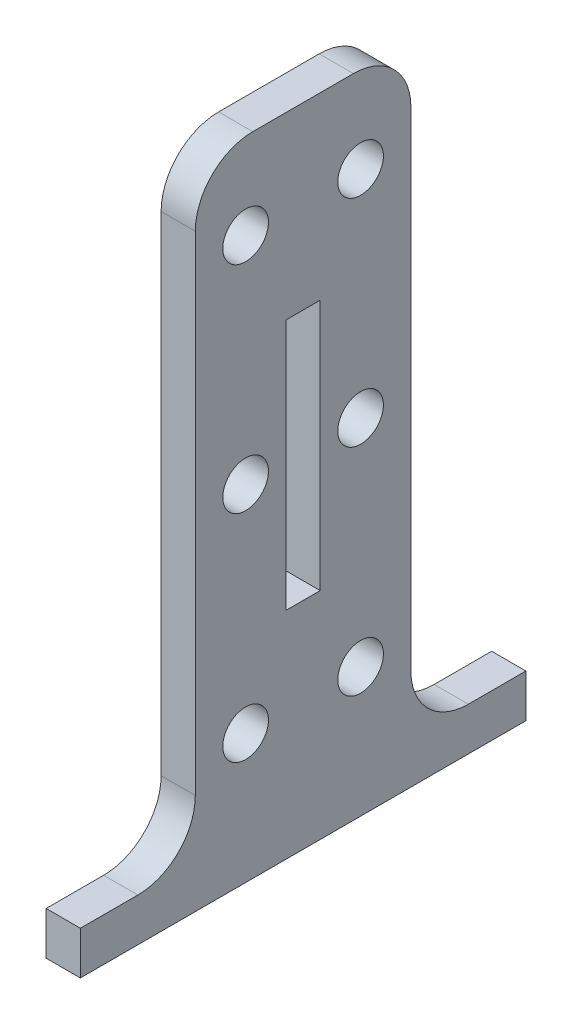
ISO-10303-21;
HEADER;
FILE_DESCRIPTION(('STEP AP214'),'2;1');
FILE_NAME('part.step','',(''),(''),'','','');
FILE_SCHEMA(('AUTOMOTIVE_DESIGN { 1 0 10303 214 1 1 1 1 }'));
ENDSEC;
DATA;
#1=APPLICATION_CONTEXT('core data for automotive mechanical design processes');
#2=APPLICATION_PROTOCOL_DEFINITION('international standard','automotive_design',2000,#1);
#3=PRODUCT_CONTEXT('',#1,'mechanical');
#4=PRODUCT('Part','Part','',(#3));
#5=PRODUCT_RELATED_PRODUCT_CATEGORY('part','',(#4));
#6=PRODUCT_DEFINITION_FORMATION('','',#4);
#7=PRODUCT_DEFINITION_CONTEXT('part definition',#1,'design');
#8=PRODUCT_DEFINITION('design','',#6,#7);
#9=PRODUCT_DEFINITION_SHAPE('','',#8);
#10=(LENGTH_UNIT() NAMED_UNIT(*) SI_UNIT(.MILLI.,.METRE.));
#11=(NAMED_UNIT(*) PLANE_ANGLE_UNIT() SI_UNIT($,.RADIAN.));
#12=(NAMED_UNIT(*) SI_UNIT($,.STERADIAN.) SOLID_ANGLE_UNIT());
#13=UNCERTAINTY_MEASURE_WITH_UNIT(LENGTH_MEASURE(1.E-05),#10,'distance_accuracy_value','');
#14=(GEOMETRIC_REPRESENTATION_CONTEXT(3) GLOBAL_UNCERTAINTY_ASSIGNED_CONTEXT((#13)) GLOBAL_UNIT_ASSIGNED_CONTEXT((#10,
#11,#12)) REPRESENTATION_CONTEXT('',''));
#15=CARTESIAN_POINT('',(0.,0.,0.));
#16=DIRECTION('',(0.,0.,1.));
#17=DIRECTION('',(1.,0.,0.));
#18=AXIS2_PLACEMENT_3D('',#15,#16,#17);
#19=CARTESIAN_POINT('',(4.76,-65.,12.62));
#20=DIRECTION('',(0.,0.,-1.));
#21=DIRECTION('',(0.,1.,0.));
#22=AXIS2_PLACEMENT_3D('',#19,#20,#21);
#23=PLANE('',#22);
#24=DIRECTION('',(-1.,0.,0.));
#25=VECTOR('',#24,1.);
#26=CARTESIAN_POINT('',(4.76,30.,12.62));
#27=LINE('',#26,#25);
#28=CARTESIAN_POINT('',(4.76,30.,12.62));
#29=VERTEX_POINT('',#28);
#30=CARTESIAN_POINT('',(0.,30.,12.62));
#31=VERTEX_POINT('',#30);
#32=EDGE_CURVE('E64',#29,#31,#27,.T.);
#33=ORIENTED_EDGE('',*,*,#32,.F.);
#34=DIRECTION('',(0.,-1.,0.));
#35=VECTOR('',#34,1.);
#36=CARTESIAN_POINT('',(4.76,-65.,12.62));
#37=LINE('',#36,#35);
#38=CARTESIAN_POINT('',(4.76,65.,12.62));
#39=VERTEX_POINT('',#38);
#40=EDGE_CURVE('E186',#39,#29,#37,.T.);
#41=ORIENTED_EDGE('',*,*,#40,.F.);
#42=DIRECTION('',(-1.,0.,0.));
#43=VECTOR('',#42,1.);
#44=CARTESIAN_POINT('',(4.76,65.,12.62));
#45=LINE('',#44,#43);
#46=CARTESIAN_POINT('',(0.,65.,12.62));
#47=VERTEX_POINT('',#46);
#48=EDGE_CURVE('E198',#39,#47,#45,.T.);
#49=ORIENTED_EDGE('',*,*,#48,.T.);
#50=DIRECTION('',(0.,-1.,0.));
#51=VECTOR('',#50,1.);
#52=CARTESIAN_POINT('',(0.,-65.,12.62));
#53=LINE('',#52,#51);
#54=EDGE_CURVE('E59',#47,#31,#53,.T.);
#55=ORIENTED_EDGE('',*,*,#54,.T.);
#56=EDGE_LOOP('',(#33,#41,#49,#55));
#57=FACE_BOUND('',#56,.T.);
#58=ADVANCED_FACE('F43',(#57),#23,.F.);
#59=CARTESIAN_POINT('',(4.76,-65.,17.38));
#60=DIRECTION('',(0.,0.,1.));
#61=DIRECTION('',(1.,0.,0.));
#62=AXIS2_PLACEMENT_3D('',#59,#60,#61);
#63=PLANE('',#62);
#64=DIRECTION('',(-1.,0.,0.));
#65=VECTOR('',#64,1.);
#66=CARTESIAN_POINT('',(4.76,30.,17.38));
#67=LINE('',#66,#65);
#68=CARTESIAN_POINT('',(4.76,30.,17.38));
#69=VERTEX_POINT('',#68);
#70=CARTESIAN_POINT('',(0.,30.,17.38));
#71=VERTEX_POINT('',#70);
#72=EDGE_CURVE('E169',#69,#71,#67,.T.);
#73=ORIENTED_EDGE('',*,*,#72,.T.);
#74=DIRECTION('',(0.,1.,0.));
#75=VECTOR('',#74,1.);
#76=CARTESIAN_POINT('',(0.,-65.,17.38));
#77=LINE('',#76,#75);
#78=CARTESIAN_POINT('',(0.,65.,17.38));
#79=VERTEX_POINT('',#78);
#80=EDGE_CURVE('E155',#71,#79,#77,.T.);
#81=ORIENTED_EDGE('',*,*,#80,.T.);
#82=DIRECTION('',(-1.,0.,0.));
#83=VECTOR('',#82,1.);
#84=CARTESIAN_POINT('',(4.76,65.,17.38));
#85=LINE('',#84,#83);
#86=CARTESIAN_POINT('',(4.76,65.,17.38));
#87=VERTEX_POINT('',#86);
#88=EDGE_CURVE('E193',#87,#79,#85,.T.);
#89=ORIENTED_EDGE('',*,*,#88,.F.);
#90=DIRECTION('',(0.,-1.,0.));
#91=VECTOR('',#90,1.);
#92=CARTESIAN_POINT('',(4.76,0.,17.38));
#93=LINE('',#92,#91);
#94=EDGE_CURVE('E11',#87,#69,#93,.T.);
#95=ORIENTED_EDGE('',*,*,#94,.T.);
#96=EDGE_LOOP('',(#73,#81,#89,#95));
#97=FACE_BOUND('',#96,.T.);
#98=ADVANCED_FACE('F170',(#97),#63,.F.);
#99=CARTESIAN_POINT('',(0.,0.,30.));
#100=DIRECTION('',(0.,0.,-1.));
#101=DIRECTION('',(-1.,0.,0.));
#102=AXIS2_PLACEMENT_3D('',#99,#100,#101);
#103=PLANE('',#102);
#104=DIRECTION('',(0.,-1.,0.));
#105=VECTOR('',#104,1.);
#106=CARTESIAN_POINT('',(4.76,0.,30.));
#107=LINE('',#106,#105);
#108=CARTESIAN_POINT('',(4.76,82.,30.));
#109=VERTEX_POINT('',#108);
#110=CARTESIAN_POINT('',(4.76,14.,30.));
#111=VERTEX_POINT('',#110);
#112=EDGE_CURVE('E254',#109,#111,#107,.T.);
#113=ORIENTED_EDGE('',*,*,#112,.F.);
#114=DIRECTION('',(1.,0.,0.));
#115=VECTOR('',#114,1.);
#116=CARTESIAN_POINT('',(0.,82.,30.));
#117=LINE('',#116,#115);
#118=CARTESIAN_POINT('',(0.,82.,30.));
#119=VERTEX_POINT('',#118);
#120=EDGE_CURVE('E359',#109,#119,#117,.F.);
#121=ORIENTED_EDGE('',*,*,#120,.T.);
#122=DIRECTION('',(0.,-1.,0.));
#123=VECTOR('',#122,1.);
#124=CARTESIAN_POINT('',(0.,0.,30.));
#125=LINE('',#124,#123);
#126=CARTESIAN_POINT('',(0.,14.,30.));
#127=VERTEX_POINT('',#126);
#128=EDGE_CURVE('E322',#119,#127,#125,.T.);
#129=ORIENTED_EDGE('',*,*,#128,.T.);
#130=DIRECTION('',(-1.,0.,0.));
#131=VECTOR('',#130,1.);
#132=CARTESIAN_POINT('',(6.,14.,30.));
#133=LINE('',#132,#131);
#134=EDGE_CURVE('E334',#127,#111,#133,.F.);
#135=ORIENTED_EDGE('',*,*,#134,.T.);
#136=EDGE_LOOP('',(#113,#121,#129,#135));
#137=FACE_BOUND('',#136,.T.);
#138=ADVANCED_FACE('F397',(#137),#103,.F.);
#139=CARTESIAN_POINT('',(60.,0.,30.));
#140=DIRECTION('',(0.,1.,0.));
#141=DIRECTION('',(-1.,0.,0.));
#142=AXIS2_PLACEMENT_3D('',#139,#140,#141);
#143=PLANE('',#142);
#144=DIRECTION('',(0.,0.,-1.));
#145=VECTOR('',#144,1.);
#146=CARTESIAN_POINT('',(0.,0.,30.));
#147=LINE('',#146,#145);
#148=CARTESIAN_POINT('',(0.,0.,46.));
#149=VERTEX_POINT('',#148);
#150=CARTESIAN_POINT('',(0.,0.,-16.));
#151=VERTEX_POINT('',#150);
#152=EDGE_CURVE('E325',#149,#151,#147,.T.);
#153=ORIENTED_EDGE('',*,*,#152,.T.);
#154=DIRECTION('',(-1.,0.,0.));
#155=VECTOR('',#154,1.);
#156=CARTESIAN_POINT('',(56.4,0.,-16.));
#157=LINE('',#156,#155);
#158=CARTESIAN_POINT('',(4.76,0.,-16.));
#159=VERTEX_POINT('',#158);
#160=EDGE_CURVE('E287',#159,#151,#157,.T.);
#161=ORIENTED_EDGE('',*,*,#160,.F.);
#162=DIRECTION('',(0.,0.,-1.));
#163=VECTOR('',#162,1.);
#164=CARTESIAN_POINT('',(4.76,0.,-16.));
#165=LINE('',#164,#163);
#166=CARTESIAN_POINT('',(4.76,0.,46.));
#167=VERTEX_POINT('',#166);
#168=EDGE_CURVE('E212',#167,#159,#165,.T.);
#169=ORIENTED_EDGE('',*,*,#168,.F.);
#170=DIRECTION('',(1.,0.,0.));
#171=VECTOR('',#170,1.);
#172=CARTESIAN_POINT('',(56.4,0.,46.));
#173=LINE('',#172,#171);
#174=EDGE_CURVE('E309',#149,#167,#173,.T.);
#175=ORIENTED_EDGE('',*,*,#174,.F.);
#176=EDGE_LOOP('',(#153,#161,#169,#175));
#177=FACE_BOUND('',#176,.T.);
#178=ADVANCED_FACE('F462',(#177),#143,.F.);
#179=CARTESIAN_POINT('',(0.,0.,0.));
#180=DIRECTION('',(0.,0.,-1.));
#181=DIRECTION('',(-1.,0.,0.));
#182=AXIS2_PLACEMENT_3D('',#179,#180,#181);
#183=PLANE('',#182);
#184=DIRECTION('',(1.,0.,0.));
#185=VECTOR('',#184,1.);
#186=CARTESIAN_POINT('',(6.,82.,0.));
#187=LINE('',#186,#185);
#188=CARTESIAN_POINT('',(0.,82.,0.));
#189=VERTEX_POINT('',#188);
#190=CARTESIAN_POINT('',(4.76,82.,0.));
#191=VERTEX_POINT('',#190);
#192=EDGE_CURVE('E52',#189,#191,#187,.T.);
#193=ORIENTED_EDGE('',*,*,#192,.T.);
#194=DIRECTION('',(0.,-1.,0.));
#195=VECTOR('',#194,1.);
#196=CARTESIAN_POINT('',(4.76,0.,0.));
#197=LINE('',#196,#195);
#198=CARTESIAN_POINT('',(4.76,14.,0.));
#199=VERTEX_POINT('',#198);
#200=EDGE_CURVE('E240',#191,#199,#197,.T.);
#201=ORIENTED_EDGE('',*,*,#200,.T.);
#202=DIRECTION('',(1.,0.,0.));
#203=VECTOR('',#202,1.);
#204=CARTESIAN_POINT('',(0.,14.,0.));
#205=LINE('',#204,#203);
#206=CARTESIAN_POINT('',(0.,14.,0.));
#207=VERTEX_POINT('',#206);
#208=EDGE_CURVE('E342',#199,#207,#205,.F.);
#209=ORIENTED_EDGE('',*,*,#208,.T.);
#210=DIRECTION('',(0.,-1.,0.));
#211=VECTOR('',#210,1.);
#212=CARTESIAN_POINT('',(0.,0.,0.));
#213=LINE('',#212,#211);
#214=EDGE_CURVE('E321',#189,#207,#213,.T.);
#215=ORIENTED_EDGE('',*,*,#214,.F.);
#216=EDGE_LOOP('',(#193,#201,#209,#215));
#217=FACE_BOUND('',#216,.T.);
#218=ADVANCED_FACE('F458',(#217),#183,.T.);
#219=CARTESIAN_POINT('',(60.,6.,12.));
#220=DIRECTION('',(0.,-1.,0.));
#221=DIRECTION('',(0.,0.,-1.));
#222=AXIS2_PLACEMENT_3D('',#219,#220,#221);
#223=PLANE('',#222);
#224=DIRECTION('',(0.,0.,1.));
#225=VECTOR('',#224,1.);
#226=CARTESIAN_POINT('',(4.76,6.,12.));
#227=LINE('',#226,#225);
#228=CARTESIAN_POINT('',(4.76,5.99999999999999,-16.));
#229=VERTEX_POINT('',#228);
#230=CARTESIAN_POINT('',(4.76,6.,-8.));
#231=VERTEX_POINT('',#230);
#232=EDGE_CURVE('E247',#229,#231,#227,.T.);
#233=ORIENTED_EDGE('',*,*,#232,.F.);
#234=DIRECTION('',(1.,0.,0.));
#235=VECTOR('',#234,1.);
#236=CARTESIAN_POINT('',(56.4,6.,-16.));
#237=LINE('',#236,#235);
#238=CARTESIAN_POINT('',(0.,6.,-16.));
#239=VERTEX_POINT('',#238);
#240=EDGE_CURVE('E294',#239,#229,#237,.T.);
#241=ORIENTED_EDGE('',*,*,#240,.F.);
#242=DIRECTION('',(0.,0.,1.));
#243=VECTOR('',#242,1.);
#244=CARTESIAN_POINT('',(0.,6.,-16.));
#245=LINE('',#244,#243);
#246=CARTESIAN_POINT('',(0.,6.,-8.));
#247=VERTEX_POINT('',#246);
#248=EDGE_CURVE('E298',#239,#247,#245,.T.);
#249=ORIENTED_EDGE('',*,*,#248,.T.);
#250=DIRECTION('',(1.,0.,0.));
#251=VECTOR('',#250,1.);
#252=CARTESIAN_POINT('',(60.,6.,-8.));
#253=LINE('',#252,#251);
#254=EDGE_CURVE('E338',#247,#231,#253,.T.);
#255=ORIENTED_EDGE('',*,*,#254,.T.);
#256=EDGE_LOOP('',(#233,#241,#249,#255));
#257=FACE_BOUND('',#256,.T.);
#258=ADVANCED_FACE('F454',(#257),#223,.F.);
#259=CARTESIAN_POINT('',(60.,6.,18.));
#260=DIRECTION('',(0.,-1.,0.));
#261=DIRECTION('',(0.,0.,-1.));
#262=AXIS2_PLACEMENT_3D('',#259,#260,#261);
#263=PLANE('',#262);
#264=DIRECTION('',(0.,0.,1.));
#265=VECTOR('',#264,1.);
#266=CARTESIAN_POINT('',(4.76,6.,18.));
#267=LINE('',#266,#265);
#268=CARTESIAN_POINT('',(4.76,6.,38.));
#269=VERTEX_POINT('',#268);
#270=CARTESIAN_POINT('',(4.76,6.,46.));
#271=VERTEX_POINT('',#270);
#272=EDGE_CURVE('E260',#269,#271,#267,.T.);
#273=ORIENTED_EDGE('',*,*,#272,.F.);
#274=DIRECTION('',(-1.,0.,0.));
#275=VECTOR('',#274,1.);
#276=CARTESIAN_POINT('',(0.,6.,38.));
#277=LINE('',#276,#275);
#278=CARTESIAN_POINT('',(0.,6.,38.));
#279=VERTEX_POINT('',#278);
#280=EDGE_CURVE('E331',#269,#279,#277,.T.);
#281=ORIENTED_EDGE('',*,*,#280,.T.);
#282=DIRECTION('',(0.,0.,-1.));
#283=VECTOR('',#282,1.);
#284=CARTESIAN_POINT('',(0.,6.,46.));
#285=LINE('',#284,#283);
#286=CARTESIAN_POINT('',(0.,6.,46.));
#287=VERTEX_POINT('',#286);
#288=EDGE_CURVE('E313',#287,#279,#285,.T.);
#289=ORIENTED_EDGE('',*,*,#288,.F.);
#290=DIRECTION('',(-1.,0.,0.));
#291=VECTOR('',#290,1.);
#292=CARTESIAN_POINT('',(56.4,6.,46.));
#293=LINE('',#292,#291);
#294=EDGE_CURVE('E302',#271,#287,#293,.T.);
#295=ORIENTED_EDGE('',*,*,#294,.F.);
#296=EDGE_LOOP('',(#273,#281,#289,#295));
#297=FACE_BOUND('',#296,.T.);
#298=ADVANCED_FACE('F450',(#297),#263,.F.);
#299=CARTESIAN_POINT('',(0.,90.,30.));
#300=DIRECTION('',(0.,-1.,0.));
#301=DIRECTION('',(0.,0.,-1.));
#302=AXIS2_PLACEMENT_3D('',#299,#300,#301);
#303=PLANE('',#302);
#304=DIRECTION('',(0.,0.,1.));
#305=VECTOR('',#304,1.);
#306=CARTESIAN_POINT('',(4.76,90.,-16.));
#307=LINE('',#306,#305);
#308=CARTESIAN_POINT('',(4.76,90.,8.));
#309=VERTEX_POINT('',#308);
#310=CARTESIAN_POINT('',(4.76,90.,22.));
#311=VERTEX_POINT('',#310);
#312=EDGE_CURVE('E206',#309,#311,#307,.T.);
#313=ORIENTED_EDGE('',*,*,#312,.F.);
#314=DIRECTION('',(1.,0.,0.));
#315=VECTOR('',#314,1.);
#316=CARTESIAN_POINT('',(0.,90.,8.));
#317=LINE('',#316,#315);
#318=CARTESIAN_POINT('',(0.,90.,8.));
#319=VERTEX_POINT('',#318);
#320=EDGE_CURVE('E352',#309,#319,#317,.F.);
#321=ORIENTED_EDGE('',*,*,#320,.T.);
#322=DIRECTION('',(0.,0.,-1.));
#323=VECTOR('',#322,1.);
#324=CARTESIAN_POINT('',(0.,90.,30.));
#325=LINE('',#324,#323);
#326=CARTESIAN_POINT('',(0.,90.,22.));
#327=VERTEX_POINT('',#326);
#328=EDGE_CURVE('E317',#327,#319,#325,.T.);
#329=ORIENTED_EDGE('',*,*,#328,.F.);
#330=DIRECTION('',(1.,0.,0.));
#331=VECTOR('',#330,1.);
#332=CARTESIAN_POINT('',(0.,90.,22.));
#333=LINE('',#332,#331);
#334=EDGE_CURVE('E355',#327,#311,#333,.T.);
#335=ORIENTED_EDGE('',*,*,#334,.T.);
#336=EDGE_LOOP('',(#313,#321,#329,#335));
#337=FACE_BOUND('',#336,.T.);
#338=ADVANCED_FACE('F446',(#337),#303,.F.);
#339=CARTESIAN_POINT('',(0.,0.,46.));
#340=DIRECTION('',(0.,0.,-1.));
#341=DIRECTION('',(-1.,0.,0.));
#342=AXIS2_PLACEMENT_3D('',#339,#340,#341);
#343=PLANE('',#342);
#344=DIRECTION('',(0.,-1.,0.));
#345=VECTOR('',#344,1.);
#346=CARTESIAN_POINT('',(4.76,0.,46.));
#347=LINE('',#346,#345);
#348=EDGE_CURVE('E209',#271,#167,#347,.T.);
#349=ORIENTED_EDGE('',*,*,#348,.F.);
#350=ORIENTED_EDGE('',*,*,#294,.T.);
#351=DIRECTION('',(0.,-1.,0.));
#352=VECTOR('',#351,1.);
#353=CARTESIAN_POINT('',(0.,6.,46.));
#354=LINE('',#353,#352);
#355=EDGE_CURVE('E305',#287,#149,#354,.T.);
#356=ORIENTED_EDGE('',*,*,#355,.T.);
#357=ORIENTED_EDGE('',*,*,#174,.T.);
#358=EDGE_LOOP('',(#349,#350,#356,#357));
#359=FACE_BOUND('',#358,.T.);
#360=ADVANCED_FACE('F442',(#359),#343,.F.);
#361=CARTESIAN_POINT('',(0.,0.,-16.));
#362=DIRECTION('',(0.,0.,-1.));
#363=DIRECTION('',(-1.,0.,0.));
#364=AXIS2_PLACEMENT_3D('',#361,#362,#363);
#365=PLANE('',#364);
#366=ORIENTED_EDGE('',*,*,#240,.T.);
#367=DIRECTION('',(0.,1.,0.));
#368=VECTOR('',#367,1.);
#369=CARTESIAN_POINT('',(4.76,0.,-16.));
#370=LINE('',#369,#368);
#371=EDGE_CURVE('E201',#159,#229,#370,.T.);
#372=ORIENTED_EDGE('',*,*,#371,.F.);
#373=ORIENTED_EDGE('',*,*,#160,.T.);
#374=DIRECTION('',(0.,1.,0.));
#375=VECTOR('',#374,1.);
#376=CARTESIAN_POINT('',(0.,6.,-16.));
#377=LINE('',#376,#375);
#378=EDGE_CURVE('E291',#151,#239,#377,.T.);
#379=ORIENTED_EDGE('',*,*,#378,.T.);
#380=EDGE_LOOP('',(#366,#372,#373,#379));
#381=FACE_BOUND('',#380,.T.);
#382=ADVANCED_FACE('F438',(#381),#365,.T.);
#383=CARTESIAN_POINT('',(60.,14.,38.));
#384=DIRECTION('',(1.,0.,0.));
#385=DIRECTION('',(0.,0.,-1.));
#386=AXIS2_PLACEMENT_3D('',#383,#384,#385);
#387=CYLINDRICAL_SURFACE('',#386,8.);
#388=CARTESIAN_POINT('',(4.76,14.,38.));
#389=DIRECTION('',(1.,0.,0.));
#390=DIRECTION('',(0.,0.,-1.));
#391=AXIS2_PLACEMENT_3D('',#388,#389,#390);
#392=CIRCLE('',#391,8.);
#393=EDGE_CURVE('E257',#111,#269,#392,.F.);
#394=ORIENTED_EDGE('',*,*,#393,.F.);
#395=ORIENTED_EDGE('',*,*,#134,.F.);
#396=CARTESIAN_POINT('',(0.,14.,38.));
#397=DIRECTION('',(1.,0.,0.));
#398=DIRECTION('',(0.,0.,-1.));
#399=AXIS2_PLACEMENT_3D('',#396,#397,#398);
#400=CIRCLE('',#399,8.);
#401=EDGE_CURVE('E345',#279,#127,#400,.T.);
#402=ORIENTED_EDGE('',*,*,#401,.F.);
#403=ORIENTED_EDGE('',*,*,#280,.F.);
#404=EDGE_LOOP('',(#394,#395,#402,#403));
#405=FACE_BOUND('',#404,.T.);
#406=ADVANCED_FACE('F441',(#405),#387,.F.);
#407=CARTESIAN_POINT('',(60.,14.,-8.));
#408=DIRECTION('',(1.,0.,0.));
#409=DIRECTION('',(0.,0.,-1.));
#410=AXIS2_PLACEMENT_3D('',#407,#408,#409);
#411=CYLINDRICAL_SURFACE('',#410,8.);
#412=CARTESIAN_POINT('',(4.76,14.,-8.));
#413=DIRECTION('',(1.,0.,0.));
#414=DIRECTION('',(0.,0.,-1.));
#415=AXIS2_PLACEMENT_3D('',#412,#413,#414);
#416=CIRCLE('',#415,8.);
#417=EDGE_CURVE('E244',#231,#199,#416,.F.);
#418=ORIENTED_EDGE('',*,*,#417,.F.);
#419=ORIENTED_EDGE('',*,*,#254,.F.);
#420=CARTESIAN_POINT('',(0.,14.,-8.));
#421=DIRECTION('',(1.,0.,0.));
#422=DIRECTION('',(0.,0.,-1.));
#423=AXIS2_PLACEMENT_3D('',#420,#421,#422);
#424=CIRCLE('',#423,8.);
#425=EDGE_CURVE('E349',#207,#247,#424,.T.);
#426=ORIENTED_EDGE('',*,*,#425,.F.);
#427=ORIENTED_EDGE('',*,*,#208,.F.);
#428=EDGE_LOOP('',(#418,#419,#426,#427));
#429=FACE_BOUND('',#428,.T.);
#430=ADVANCED_FACE('F472',(#429),#411,.F.);
#431=CARTESIAN_POINT('',(0.,82.,22.));
#432=DIRECTION('',(1.,0.,0.));
#433=DIRECTION('',(0.,0.,-1.));
#434=AXIS2_PLACEMENT_3D('',#431,#432,#433);
#435=CYLINDRICAL_SURFACE('',#434,8.);
#436=ORIENTED_EDGE('',*,*,#120,.F.);
#437=CARTESIAN_POINT('',(4.76,82.,22.));
#438=DIRECTION('',(1.,0.,0.));
#439=DIRECTION('',(0.,0.,-1.));
#440=AXIS2_PLACEMENT_3D('',#437,#438,#439);
#441=CIRCLE('',#440,8.);
#442=EDGE_CURVE('E250',#109,#311,#441,.F.);
#443=ORIENTED_EDGE('',*,*,#442,.T.);
#444=ORIENTED_EDGE('',*,*,#334,.F.);
#445=CARTESIAN_POINT('',(0.,82.,22.));
#446=DIRECTION('',(1.,0.,0.));
#447=DIRECTION('',(0.,0.,-1.));
#448=AXIS2_PLACEMENT_3D('',#445,#446,#447);
#449=CIRCLE('',#448,8.);
#450=EDGE_CURVE('E365',#119,#327,#449,.F.);
#451=ORIENTED_EDGE('',*,*,#450,.F.);
#452=EDGE_LOOP('',(#436,#443,#444,#451));
#453=FACE_BOUND('',#452,.T.);
#454=ADVANCED_FACE('F434',(#453),#435,.T.);
#455=CARTESIAN_POINT('',(0.,82.,8.));
#456=DIRECTION('',(-1.,0.,0.));
#457=DIRECTION('',(0.,0.,1.));
#458=AXIS2_PLACEMENT_3D('',#455,#456,#457);
#459=CYLINDRICAL_SURFACE('',#458,8.);
#460=ORIENTED_EDGE('',*,*,#320,.F.);
#461=CARTESIAN_POINT('',(4.76,82.,8.));
#462=DIRECTION('',(1.,0.,0.));
#463=DIRECTION('',(0.,0.,-1.));
#464=AXIS2_PLACEMENT_3D('',#461,#462,#463);
#465=CIRCLE('',#464,8.);
#466=EDGE_CURVE('E236',#309,#191,#465,.F.);
#467=ORIENTED_EDGE('',*,*,#466,.T.);
#468=ORIENTED_EDGE('',*,*,#192,.F.);
#469=CARTESIAN_POINT('',(0.,82.,8.));
#470=DIRECTION('',(1.,0.,0.));
#471=DIRECTION('',(0.,0.,-1.));
#472=AXIS2_PLACEMENT_3D('',#469,#470,#471);
#473=CIRCLE('',#472,8.);
#474=EDGE_CURVE('E362',#319,#189,#473,.F.);
#475=ORIENTED_EDGE('',*,*,#474,.F.);
#476=EDGE_LOOP('',(#460,#467,#468,#475));
#477=FACE_BOUND('',#476,.T.);
#478=ADVANCED_FACE('F45',(#477),#459,.T.);
#479=CARTESIAN_POINT('',(0.,78.,23.));
#480=DIRECTION('',(1.,0.,0.));
#481=DIRECTION('',(0.,0.,-1.));
#482=AXIS2_PLACEMENT_3D('',#479,#480,#481);
#483=CYLINDRICAL_SURFACE('',#482,3.175);
#484=CARTESIAN_POINT('',(0.,78.,23.));
#485=DIRECTION('',(1.,0.,0.));
#486=DIRECTION('',(0.,0.,-1.));
#487=AXIS2_PLACEMENT_3D('',#484,#485,#486);
#488=CIRCLE('',#487,3.175);
#489=CARTESIAN_POINT('',(0.,78.,19.825));
#490=VERTEX_POINT('',#489);
#491=EDGE_CURVE('E268',#490,#490,#488,.T.);
#492=ORIENTED_EDGE('',*,*,#491,.F.);
#493=EDGE_LOOP('',(#492));
#494=FACE_BOUND('',#493,.T.);
#495=CARTESIAN_POINT('',(4.76,78.,23.));
#496=DIRECTION('',(1.,0.,0.));
#497=DIRECTION('',(0.,0.,-1.));
#498=AXIS2_PLACEMENT_3D('',#495,#496,#497);
#499=CIRCLE('',#498,3.175);
#500=CARTESIAN_POINT('',(4.76,78.,19.825));
#501=VERTEX_POINT('',#500);
#502=EDGE_CURVE('E232',#501,#501,#499,.F.);
#503=ORIENTED_EDGE('',*,*,#502,.F.);
#504=EDGE_LOOP('',(#503));
#505=FACE_BOUND('',#504,.T.);
#506=ADVANCED_FACE('F409',(#494,#505),#483,.F.);
#507=CARTESIAN_POINT('',(0.,48.,23.));
#508=DIRECTION('',(1.,0.,0.));
#509=DIRECTION('',(0.,0.,-1.));
#510=AXIS2_PLACEMENT_3D('',#507,#508,#509);
#511=CYLINDRICAL_SURFACE('',#510,3.175);
#512=CARTESIAN_POINT('',(0.,48.,23.));
#513=DIRECTION('',(1.,0.,0.));
#514=DIRECTION('',(0.,0.,-1.));
#515=AXIS2_PLACEMENT_3D('',#512,#513,#514);
#516=CIRCLE('',#515,3.175);
#517=CARTESIAN_POINT('',(0.,48.,19.825));
#518=VERTEX_POINT('',#517);
#519=EDGE_CURVE('E264',#518,#518,#516,.T.);
#520=ORIENTED_EDGE('',*,*,#519,.F.);
#521=EDGE_LOOP('',(#520));
#522=FACE_BOUND('',#521,.T.);
#523=CARTESIAN_POINT('',(4.76,48.,23.));
#524=DIRECTION('',(1.,0.,0.));
#525=DIRECTION('',(0.,0.,-1.));
#526=AXIS2_PLACEMENT_3D('',#523,#524,#525);
#527=CIRCLE('',#526,3.175);
#528=CARTESIAN_POINT('',(4.76,48.,19.825));
#529=VERTEX_POINT('',#528);
#530=EDGE_CURVE('E228',#529,#529,#527,.F.);
#531=ORIENTED_EDGE('',*,*,#530,.F.);
#532=EDGE_LOOP('',(#531));
#533=FACE_BOUND('',#532,.T.);
#534=ADVANCED_FACE('F405',(#522,#533),#511,.F.);
#535=CARTESIAN_POINT('',(0.,18.,23.));
#536=DIRECTION('',(1.,0.,0.));
#537=DIRECTION('',(0.,0.,-1.));
#538=AXIS2_PLACEMENT_3D('',#535,#536,#537);
#539=CYLINDRICAL_SURFACE('',#538,3.175);
#540=CARTESIAN_POINT('',(0.,18.,23.));
#541=DIRECTION('',(1.,0.,0.));
#542=DIRECTION('',(0.,0.,-1.));
#543=AXIS2_PLACEMENT_3D('',#540,#541,#542);
#544=CIRCLE('',#543,3.175);
#545=CARTESIAN_POINT('',(0.,18.,19.825));
#546=VERTEX_POINT('',#545);
#547=EDGE_CURVE('E269',#546,#546,#544,.T.);
#548=ORIENTED_EDGE('',*,*,#547,.F.);
#549=EDGE_LOOP('',(#548));
#550=FACE_BOUND('',#549,.T.);
#551=CARTESIAN_POINT('',(4.76,18.,23.));
#552=DIRECTION('',(1.,0.,0.));
#553=DIRECTION('',(0.,0.,-1.));
#554=AXIS2_PLACEMENT_3D('',#551,#552,#553);
#555=CIRCLE('',#554,3.175);
#556=CARTESIAN_POINT('',(4.76,18.,19.825));
#557=VERTEX_POINT('',#556);
#558=EDGE_CURVE('E224',#557,#557,#555,.F.);
#559=ORIENTED_EDGE('',*,*,#558,.F.);
#560=EDGE_LOOP('',(#559));
#561=FACE_BOUND('',#560,.T.);
#562=ADVANCED_FACE('F408',(#550,#561),#539,.F.);
#563=CARTESIAN_POINT('',(0.,18.0000000000001,6.99999999999998));
#564=DIRECTION('',(1.,0.,0.));
#565=DIRECTION('',(0.,0.,-1.));
#566=AXIS2_PLACEMENT_3D('',#563,#564,#565);
#567=CYLINDRICAL_SURFACE('',#566,3.175);
#568=CARTESIAN_POINT('',(0.,18.0000000000001,6.99999999999998));
#569=DIRECTION('',(1.,0.,0.));
#570=DIRECTION('',(0.,0.,1.));
#571=AXIS2_PLACEMENT_3D('',#568,#569,#570);
#572=CIRCLE('',#571,3.175);
#573=CARTESIAN_POINT('',(0.,18.0000000000001,10.175));
#574=VERTEX_POINT('',#573);
#575=EDGE_CURVE('E273',#574,#574,#572,.T.);
#576=ORIENTED_EDGE('',*,*,#575,.F.);
#577=EDGE_LOOP('',(#576));
#578=FACE_BOUND('',#577,.T.);
#579=CARTESIAN_POINT('',(4.76,18.0000000000001,6.99999999999998));
#580=DIRECTION('',(1.,0.,0.));
#581=DIRECTION('',(0.,0.,-1.));
#582=AXIS2_PLACEMENT_3D('',#579,#580,#581);
#583=CIRCLE('',#582,3.175);
#584=CARTESIAN_POINT('',(4.76,18.0000000000001,3.82499999999998));
#585=VERTEX_POINT('',#584);
#586=EDGE_CURVE('E220',#585,#585,#583,.F.);
#587=ORIENTED_EDGE('',*,*,#586,.F.);
#588=EDGE_LOOP('',(#587));
#589=FACE_BOUND('',#588,.T.);
#590=ADVANCED_FACE('F387',(#578,#589),#567,.F.);
#591=CARTESIAN_POINT('',(0.,48.,6.99999999999998));
#592=DIRECTION('',(1.,0.,0.));
#593=DIRECTION('',(0.,0.,-1.));
#594=AXIS2_PLACEMENT_3D('',#591,#592,#593);
#595=CYLINDRICAL_SURFACE('',#594,3.175);
#596=CARTESIAN_POINT('',(0.,48.,6.99999999999998));
#597=DIRECTION('',(1.,0.,0.));
#598=DIRECTION('',(0.,0.,1.));
#599=AXIS2_PLACEMENT_3D('',#596,#597,#598);
#600=CIRCLE('',#599,3.175);
#601=CARTESIAN_POINT('',(0.,48.,10.175));
#602=VERTEX_POINT('',#601);
#603=EDGE_CURVE('E277',#602,#602,#600,.T.);
#604=ORIENTED_EDGE('',*,*,#603,.F.);
#605=EDGE_LOOP('',(#604));
#606=FACE_BOUND('',#605,.T.);
#607=CARTESIAN_POINT('',(4.76,48.,6.99999999999998));
#608=DIRECTION('',(1.,0.,0.));
#609=DIRECTION('',(0.,0.,-1.));
#610=AXIS2_PLACEMENT_3D('',#607,#608,#609);
#611=CIRCLE('',#610,3.175);
#612=CARTESIAN_POINT('',(4.76,48.,3.82499999999998));
#613=VERTEX_POINT('',#612);
#614=EDGE_CURVE('E216',#613,#613,#611,.F.);
#615=ORIENTED_EDGE('',*,*,#614,.F.);
#616=EDGE_LOOP('',(#615));
#617=FACE_BOUND('',#616,.T.);
#618=ADVANCED_FACE('F379',(#606,#617),#595,.F.);
#619=CARTESIAN_POINT('',(0.,78.,6.99999999999998));
#620=DIRECTION('',(1.,0.,0.));
#621=DIRECTION('',(0.,0.,-1.));
#622=AXIS2_PLACEMENT_3D('',#619,#620,#621);
#623=CYLINDRICAL_SURFACE('',#622,3.175);
#624=CARTESIAN_POINT('',(0.,78.,6.99999999999998));
#625=DIRECTION('',(1.,0.,0.));
#626=DIRECTION('',(0.,0.,1.));
#627=AXIS2_PLACEMENT_3D('',#624,#625,#626);
#628=CIRCLE('',#627,3.175);
#629=CARTESIAN_POINT('',(0.,78.,10.175));
#630=VERTEX_POINT('',#629);
#631=EDGE_CURVE('E263',#630,#630,#628,.T.);
#632=ORIENTED_EDGE('',*,*,#631,.F.);
#633=EDGE_LOOP('',(#632));
#634=FACE_BOUND('',#633,.T.);
#635=CARTESIAN_POINT('',(4.76,78.,6.99999999999998));
#636=DIRECTION('',(1.,0.,0.));
#637=DIRECTION('',(0.,0.,-1.));
#638=AXIS2_PLACEMENT_3D('',#635,#636,#637);
#639=CIRCLE('',#638,3.175);
#640=CARTESIAN_POINT('',(4.76,78.,3.82499999999998));
#641=VERTEX_POINT('',#640);
#642=EDGE_CURVE('E215',#641,#641,#639,.F.);
#643=ORIENTED_EDGE('',*,*,#642,.F.);
#644=EDGE_LOOP('',(#643));
#645=FACE_BOUND('',#644,.T.);
#646=ADVANCED_FACE('F377',(#634,#645),#623,.F.);
#647=CARTESIAN_POINT('',(0.,0.,30.));
#648=DIRECTION('',(1.,0.,0.));
#649=DIRECTION('',(0.,0.,-1.));
#650=AXIS2_PLACEMENT_3D('',#647,#648,#649);
#651=PLANE('',#650);
#652=DIRECTION('',(0.,0.,1.));
#653=VECTOR('',#652,1.);
#654=CARTESIAN_POINT('',(0.,30.,12.62));
#655=LINE('',#654,#653);
#656=EDGE_CURVE('E160',#31,#71,#655,.T.);
#657=ORIENTED_EDGE('',*,*,#656,.F.);
#658=ORIENTED_EDGE('',*,*,#54,.F.);
#659=DIRECTION('',(0.,0.,-1.));
#660=VECTOR('',#659,1.);
#661=CARTESIAN_POINT('',(0.,65.,17.38));
#662=LINE('',#661,#660);
#663=EDGE_CURVE('E162',#79,#47,#662,.T.);
#664=ORIENTED_EDGE('',*,*,#663,.F.);
#665=ORIENTED_EDGE('',*,*,#80,.F.);
#666=EDGE_LOOP('',(#657,#658,#664,#665));
#667=FACE_BOUND('',#666,.T.);
#668=ORIENTED_EDGE('',*,*,#631,.T.);
#669=EDGE_LOOP('',(#668));
#670=FACE_BOUND('',#669,.T.);
#671=ORIENTED_EDGE('',*,*,#603,.T.);
#672=EDGE_LOOP('',(#671));
#673=FACE_BOUND('',#672,.T.);
#674=ORIENTED_EDGE('',*,*,#575,.T.);
#675=EDGE_LOOP('',(#674));
#676=FACE_BOUND('',#675,.T.);
#677=ORIENTED_EDGE('',*,*,#547,.T.);
#678=EDGE_LOOP('',(#677));
#679=FACE_BOUND('',#678,.T.);
#680=ORIENTED_EDGE('',*,*,#519,.T.);
#681=EDGE_LOOP('',(#680));
#682=FACE_BOUND('',#681,.T.);
#683=ORIENTED_EDGE('',*,*,#491,.T.);
#684=EDGE_LOOP('',(#683));
#685=FACE_BOUND('',#684,.T.);
#686=ORIENTED_EDGE('',*,*,#378,.F.);
#687=ORIENTED_EDGE('',*,*,#152,.F.);
#688=ORIENTED_EDGE('',*,*,#355,.F.);
#689=ORIENTED_EDGE('',*,*,#288,.T.);
#690=ORIENTED_EDGE('',*,*,#401,.T.);
#691=ORIENTED_EDGE('',*,*,#128,.F.);
#692=ORIENTED_EDGE('',*,*,#450,.T.);
#693=ORIENTED_EDGE('',*,*,#328,.T.);
#694=ORIENTED_EDGE('',*,*,#474,.T.);
#695=ORIENTED_EDGE('',*,*,#214,.T.);
#696=ORIENTED_EDGE('',*,*,#425,.T.);
#697=ORIENTED_EDGE('',*,*,#248,.F.);
#698=EDGE_LOOP('',(#686,#687,#688,#689,#690,#691,#692,#693,#694,#695,#696,#697));
#699=FACE_BOUND('',#698,.T.);
#700=ADVANCED_FACE('F157',(#667,#670,#673,#676,#679,#682,#685,#699),#651,.F.);
#701=CARTESIAN_POINT('',(4.76,0.,0.));
#702=DIRECTION('',(1.,0.,0.));
#703=DIRECTION('',(0.,0.,-1.));
#704=AXIS2_PLACEMENT_3D('',#701,#702,#703);
#705=PLANE('',#704);
#706=ORIENTED_EDGE('',*,*,#40,.T.);
#707=DIRECTION('',(0.,0.,1.));
#708=VECTOR('',#707,1.);
#709=CARTESIAN_POINT('',(4.76,30.,12.62));
#710=LINE('',#709,#708);
#711=EDGE_CURVE('E176',#29,#69,#710,.T.);
#712=ORIENTED_EDGE('',*,*,#711,.T.);
#713=ORIENTED_EDGE('',*,*,#94,.F.);
#714=DIRECTION('',(0.,0.,-1.));
#715=VECTOR('',#714,1.);
#716=CARTESIAN_POINT('',(4.76,65.,17.38));
#717=LINE('',#716,#715);
#718=EDGE_CURVE('E189',#87,#39,#717,.T.);
#719=ORIENTED_EDGE('',*,*,#718,.T.);
#720=EDGE_LOOP('',(#706,#712,#713,#719));
#721=FACE_BOUND('',#720,.T.);
#722=ORIENTED_EDGE('',*,*,#168,.T.);
#723=ORIENTED_EDGE('',*,*,#371,.T.);
#724=ORIENTED_EDGE('',*,*,#232,.T.);
#725=ORIENTED_EDGE('',*,*,#417,.T.);
#726=ORIENTED_EDGE('',*,*,#200,.F.);
#727=ORIENTED_EDGE('',*,*,#466,.F.);
#728=ORIENTED_EDGE('',*,*,#312,.T.);
#729=ORIENTED_EDGE('',*,*,#442,.F.);
#730=ORIENTED_EDGE('',*,*,#112,.T.);
#731=ORIENTED_EDGE('',*,*,#393,.T.);
#732=ORIENTED_EDGE('',*,*,#272,.T.);
#733=ORIENTED_EDGE('',*,*,#348,.T.);
#734=EDGE_LOOP('',(#722,#723,#724,#725,#726,#727,#728,#729,#730,#731,#732,#733));
#735=FACE_BOUND('',#734,.T.);
#736=ORIENTED_EDGE('',*,*,#642,.T.);
#737=EDGE_LOOP('',(#736));
#738=FACE_BOUND('',#737,.T.);
#739=ORIENTED_EDGE('',*,*,#614,.T.);
#740=EDGE_LOOP('',(#739));
#741=FACE_BOUND('',#740,.T.);
#742=ORIENTED_EDGE('',*,*,#586,.T.);
#743=EDGE_LOOP('',(#742));
#744=FACE_BOUND('',#743,.T.);
#745=ORIENTED_EDGE('',*,*,#558,.T.);
#746=EDGE_LOOP('',(#745));
#747=FACE_BOUND('',#746,.T.);
#748=ORIENTED_EDGE('',*,*,#530,.T.);
#749=EDGE_LOOP('',(#748));
#750=FACE_BOUND('',#749,.T.);
#751=ORIENTED_EDGE('',*,*,#502,.T.);
#752=EDGE_LOOP('',(#751));
#753=FACE_BOUND('',#752,.T.);
#754=ADVANCED_FACE('F374',(#721,#735,#738,#741,#744,#747,#750,#753),#705,.T.);
#755=CARTESIAN_POINT('',(4.76,65.,17.38));
#756=DIRECTION('',(0.,1.,0.));
#757=DIRECTION('',(0.,0.,1.));
#758=AXIS2_PLACEMENT_3D('',#755,#756,#757);
#759=PLANE('',#758);
#760=ORIENTED_EDGE('',*,*,#663,.T.);
#761=ORIENTED_EDGE('',*,*,#48,.F.);
#762=ORIENTED_EDGE('',*,*,#718,.F.);
#763=ORIENTED_EDGE('',*,*,#88,.T.);
#764=EDGE_LOOP('',(#760,#761,#762,#763));
#765=FACE_BOUND('',#764,.T.);
#766=ADVANCED_FACE('F403',(#765),#759,.F.);
#767=CARTESIAN_POINT('',(4.76,30.,12.62));
#768=DIRECTION('',(0.,-1.,0.));
#769=DIRECTION('',(0.,0.,-1.));
#770=AXIS2_PLACEMENT_3D('',#767,#768,#769);
#771=PLANE('',#770);
#772=ORIENTED_EDGE('',*,*,#656,.T.);
#773=ORIENTED_EDGE('',*,*,#72,.F.);
#774=ORIENTED_EDGE('',*,*,#711,.F.);
#775=ORIENTED_EDGE('',*,*,#32,.T.);
#776=EDGE_LOOP('',(#772,#773,#774,#775));
#777=FACE_BOUND('',#776,.T.);
#778=ADVANCED_FACE('F178',(#777),#771,.F.);
#779=CLOSED_SHELL('',(#58,#98,#138,#178,#218,#258,#298,#338,#360,#382,#406,#430,#454,#478,#506,
#534,#562,#590,#618,#646,#700,#754,#766,#778));
#780=MANIFOLD_SOLID_BREP('B2',#779);
#781=ADVANCED_BREP_SHAPE_REPRESENTATION('',(#18,#780),#14);
#782=SHAPE_DEFINITION_REPRESENTATION(#9,#781);
ENDSEC;
END-ISO-10303-21;
